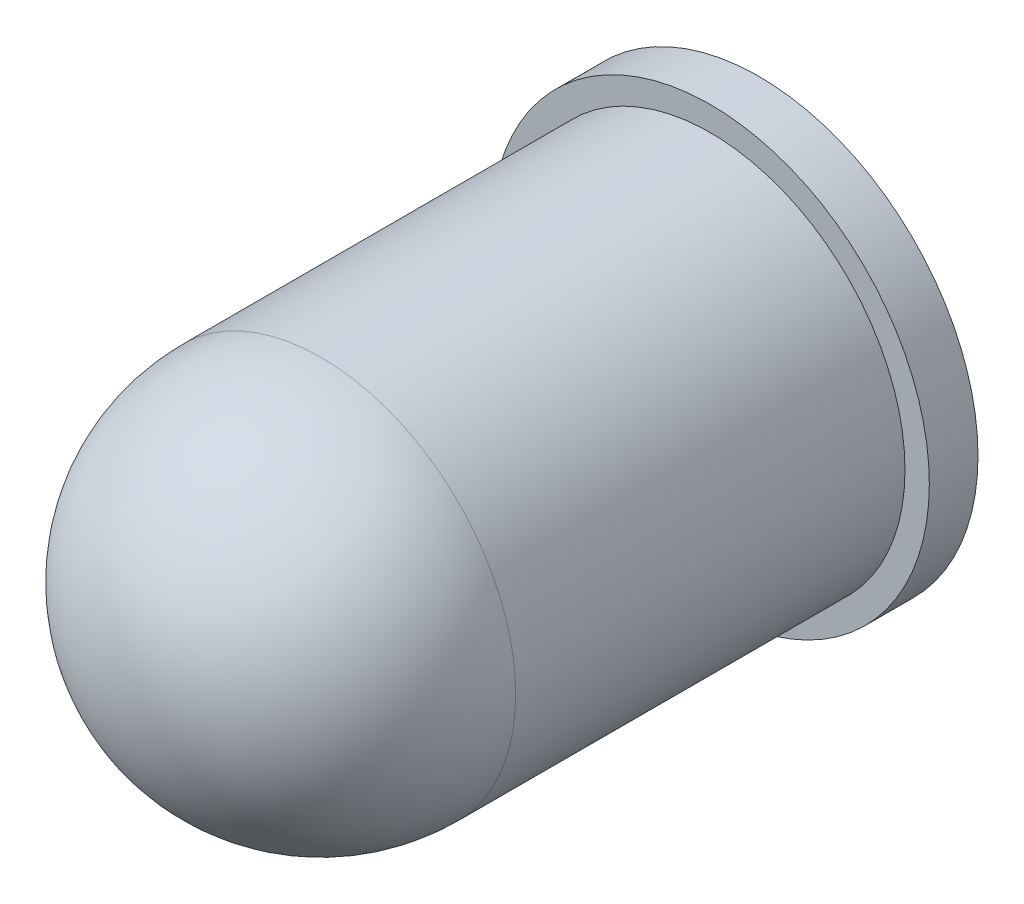
ISO-10303-21;
HEADER;
FILE_DESCRIPTION(('STEP AP214'),'2;1');
FILE_NAME('part.step','',(''),(''),'','','');
FILE_SCHEMA(('AUTOMOTIVE_DESIGN { 1 0 10303 214 1 1 1 1 }'));
ENDSEC;
DATA;
#1=APPLICATION_CONTEXT('core data for automotive mechanical design processes');
#2=APPLICATION_PROTOCOL_DEFINITION('international standard','automotive_design',2000,#1);
#3=PRODUCT_CONTEXT('',#1,'mechanical');
#4=PRODUCT('Part','Part','',(#3));
#5=PRODUCT_RELATED_PRODUCT_CATEGORY('part','',(#4));
#6=PRODUCT_DEFINITION_FORMATION('','',#4);
#7=PRODUCT_DEFINITION_CONTEXT('part definition',#1,'design');
#8=PRODUCT_DEFINITION('design','',#6,#7);
#9=PRODUCT_DEFINITION_SHAPE('','',#8);
#10=(LENGTH_UNIT() NAMED_UNIT(*) SI_UNIT(.MILLI.,.METRE.));
#11=(NAMED_UNIT(*) PLANE_ANGLE_UNIT() SI_UNIT($,.RADIAN.));
#12=(NAMED_UNIT(*) SI_UNIT($,.STERADIAN.) SOLID_ANGLE_UNIT());
#13=UNCERTAINTY_MEASURE_WITH_UNIT(LENGTH_MEASURE(1.E-05),#10,'distance_accuracy_value','');
#14=(GEOMETRIC_REPRESENTATION_CONTEXT(3) GLOBAL_UNCERTAINTY_ASSIGNED_CONTEXT((#13)) GLOBAL_UNIT_ASSIGNED_CONTEXT((#10,
#11,#12)) REPRESENTATION_CONTEXT('',''));
#15=CARTESIAN_POINT('',(0.,0.,0.));
#16=DIRECTION('',(0.,0.,1.));
#17=DIRECTION('',(1.,0.,0.));
#18=AXIS2_PLACEMENT_3D('',#15,#16,#17);
#19=CARTESIAN_POINT('',(0.,0.,0.));
#20=DIRECTION('',(0.,0.,-1.));
#21=DIRECTION('',(-1.,0.,0.));
#22=AXIS2_PLACEMENT_3D('',#19,#20,#21);
#23=PLANE('',#22);
#24=CARTESIAN_POINT('',(0.,0.,0.));
#25=DIRECTION('',(0.,0.,1.));
#26=DIRECTION('',(1.,0.,0.));
#27=AXIS2_PLACEMENT_3D('',#24,#25,#26);
#28=CIRCLE('',#27,3.);
#29=CARTESIAN_POINT('',(3.,0.,0.));
#30=VERTEX_POINT('',#29);
#31=EDGE_CURVE('E58',#30,#30,#28,.T.);
#32=ORIENTED_EDGE('',*,*,#31,.T.);
#33=EDGE_LOOP('',(#32));
#34=FACE_BOUND('',#33,.T.);
#35=CARTESIAN_POINT('',(0.,0.,0.));
#36=DIRECTION('',(0.,0.,1.));
#37=DIRECTION('',(1.,0.,0.));
#38=AXIS2_PLACEMENT_3D('',#35,#36,#37);
#39=CIRCLE('',#38,4.5);
#40=CARTESIAN_POINT('',(4.5,0.,0.));
#41=VERTEX_POINT('',#40);
#42=EDGE_CURVE('E10',#41,#41,#39,.T.);
#43=ORIENTED_EDGE('',*,*,#42,.F.);
#44=EDGE_LOOP('',(#43));
#45=FACE_BOUND('',#44,.T.);
#46=ADVANCED_FACE('F41',(#34,#45),#23,.T.);
#47=CARTESIAN_POINT('',(0.,0.,10.8054569455427));
#48=DIRECTION('',(0.,0.,1.));
#49=DIRECTION('',(1.,0.,0.));
#50=AXIS2_PLACEMENT_3D('',#47,#48,#49);
#51=CYLINDRICAL_SURFACE('',#50,4.5);
#52=ORIENTED_EDGE('',*,*,#42,.T.);
#53=EDGE_LOOP('',(#52));
#54=FACE_BOUND('',#53,.T.);
#55=CARTESIAN_POINT('',(0.,0.,0.999999999999999));
#56=DIRECTION('',(0.,0.,1.));
#57=DIRECTION('',(1.,0.,0.));
#58=AXIS2_PLACEMENT_3D('',#55,#56,#57);
#59=CIRCLE('',#58,4.5);
#60=CARTESIAN_POINT('',(4.5,0.,0.999999999999999));
#61=VERTEX_POINT('',#60);
#62=EDGE_CURVE('E50',#61,#61,#59,.T.);
#63=ORIENTED_EDGE('',*,*,#62,.F.);
#64=EDGE_LOOP('',(#63));
#65=FACE_BOUND('',#64,.T.);
#66=ADVANCED_FACE('F82',(#54,#65),#51,.T.);
#67=CARTESIAN_POINT('',(0.,0.,1.));
#68=DIRECTION('',(0.,0.,1.));
#69=DIRECTION('',(1.,0.,0.));
#70=AXIS2_PLACEMENT_3D('',#67,#68,#69);
#71=PLANE('',#70);
#72=ORIENTED_EDGE('',*,*,#62,.T.);
#73=EDGE_LOOP('',(#72));
#74=FACE_BOUND('',#73,.T.);
#75=CARTESIAN_POINT('',(0.,0.,0.999999999999999));
#76=DIRECTION('',(0.,0.,1.));
#77=DIRECTION('',(1.,0.,0.));
#78=AXIS2_PLACEMENT_3D('',#75,#76,#77);
#79=CIRCLE('',#78,4.);
#80=CARTESIAN_POINT('',(4.,0.,0.999999999999999));
#81=VERTEX_POINT('',#80);
#82=EDGE_CURVE('E51',#81,#81,#79,.T.);
#83=ORIENTED_EDGE('',*,*,#82,.F.);
#84=EDGE_LOOP('',(#83));
#85=FACE_BOUND('',#84,.T.);
#86=ADVANCED_FACE('F87',(#74,#85),#71,.T.);
#87=CARTESIAN_POINT('',(0.,0.,10.8054569455427));
#88=DIRECTION('',(0.,0.,1.));
#89=DIRECTION('',(1.,0.,0.));
#90=AXIS2_PLACEMENT_3D('',#87,#88,#89);
#91=CYLINDRICAL_SURFACE('',#90,4.);
#92=CARTESIAN_POINT('',(0.,0.,9.));
#93=DIRECTION('',(0.,0.,1.));
#94=DIRECTION('',(1.,0.,0.));
#95=AXIS2_PLACEMENT_3D('',#92,#93,#94);
#96=CIRCLE('',#95,4.);
#97=CARTESIAN_POINT('',(4.,0.,9.));
#98=VERTEX_POINT('',#97);
#99=EDGE_CURVE('E54',#98,#98,#96,.T.);
#100=ORIENTED_EDGE('',*,*,#99,.F.);
#101=EDGE_LOOP('',(#100));
#102=FACE_BOUND('',#101,.T.);
#103=ORIENTED_EDGE('',*,*,#82,.T.);
#104=EDGE_LOOP('',(#103));
#105=FACE_BOUND('',#104,.T.);
#106=ADVANCED_FACE('F85',(#102,#105),#91,.T.);
#107=CARTESIAN_POINT('',(0.,0.,9.));
#108=DIRECTION('',(0.,0.,1.));
#109=DIRECTION('',(0.,1.,0.));
#110=AXIS2_PLACEMENT_3D('',#107,#108,#109);
#111=SPHERICAL_SURFACE('',#110,4.);
#112=ORIENTED_EDGE('',*,*,#99,.T.);
#113=EDGE_LOOP('',(#112));
#114=FACE_BOUND('',#113,.T.);
#115=ADVANCED_FACE('F75',(#114),#111,.T.);
#116=CARTESIAN_POINT('',(0.,0.,10.8054569455427));
#117=DIRECTION('',(0.,0.,1.));
#118=DIRECTION('',(1.,0.,0.));
#119=AXIS2_PLACEMENT_3D('',#116,#117,#118);
#120=CYLINDRICAL_SURFACE('',#119,3.);
#121=CARTESIAN_POINT('',(0.,0.,9.));
#122=DIRECTION('',(0.,0.,1.));
#123=DIRECTION('',(1.,0.,0.));
#124=AXIS2_PLACEMENT_3D('',#121,#122,#123);
#125=CIRCLE('',#124,3.);
#126=CARTESIAN_POINT('',(3.,0.,9.));
#127=VERTEX_POINT('',#126);
#128=EDGE_CURVE('E63',#127,#127,#125,.T.);
#129=ORIENTED_EDGE('',*,*,#128,.T.);
#130=EDGE_LOOP('',(#129));
#131=FACE_BOUND('',#130,.T.);
#132=ORIENTED_EDGE('',*,*,#31,.F.);
#133=EDGE_LOOP('',(#132));
#134=FACE_BOUND('',#133,.T.);
#135=ADVANCED_FACE('F69',(#131,#134),#120,.F.);
#136=CARTESIAN_POINT('',(0.,0.,9.));
#137=DIRECTION('',(0.,0.,1.));
#138=DIRECTION('',(0.,1.,0.));
#139=AXIS2_PLACEMENT_3D('',#136,#137,#138);
#140=SPHERICAL_SURFACE('',#139,3.);
#141=ORIENTED_EDGE('',*,*,#128,.F.);
#142=EDGE_LOOP('',(#141));
#143=FACE_BOUND('',#142,.T.);
#144=ADVANCED_FACE('F73',(#143),#140,.F.);
#145=CLOSED_SHELL('',(#46,#66,#86,#106,#115,#135,#144));
#146=MANIFOLD_SOLID_BREP('B2',#145);
#147=ADVANCED_BREP_SHAPE_REPRESENTATION('',(#18,#146),#14);
#148=SHAPE_DEFINITION_REPRESENTATION(#9,#147);
ENDSEC;
END-ISO-10303-21;
